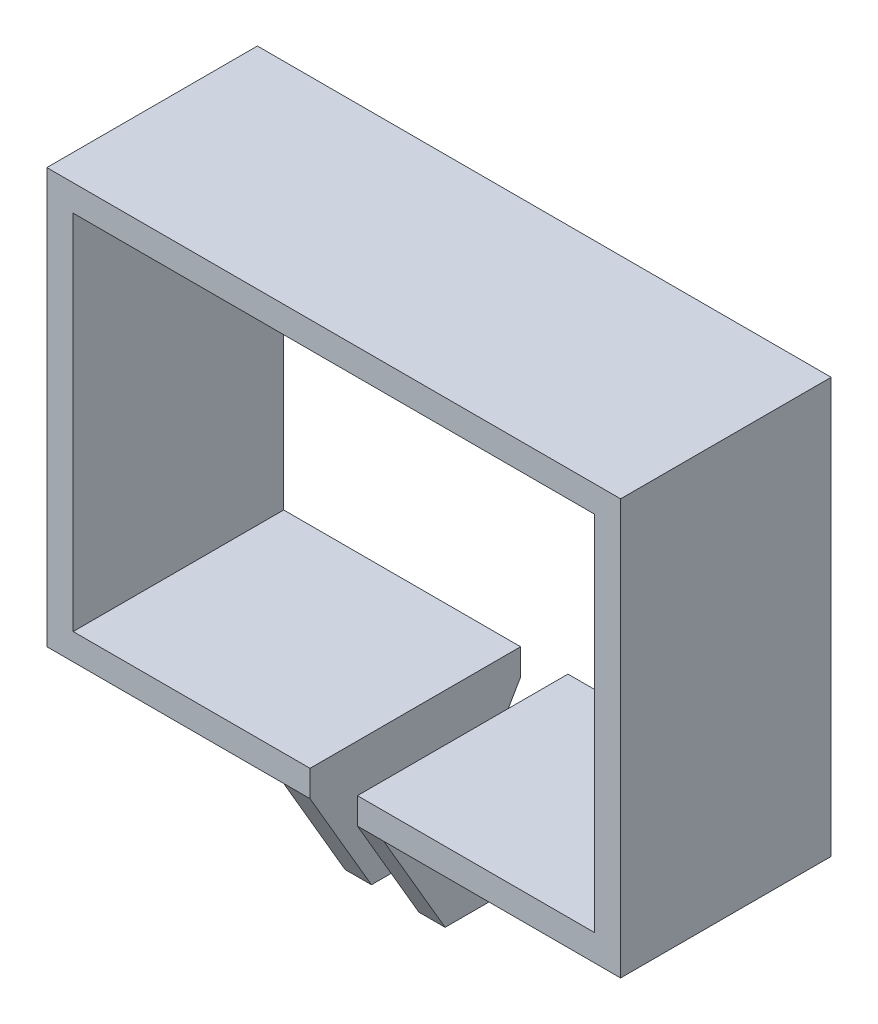
ISO-10303-21;
HEADER;
FILE_DESCRIPTION(('STEP AP214'),'2;1');
FILE_NAME('part.step','',(''),(''),'','','');
FILE_SCHEMA(('AUTOMOTIVE_DESIGN { 1 0 10303 214 1 1 1 1 }'));
ENDSEC;
DATA;
#1=APPLICATION_CONTEXT('core data for automotive mechanical design processes');
#2=APPLICATION_PROTOCOL_DEFINITION('international standard','automotive_design',2000,#1);
#3=PRODUCT_CONTEXT('',#1,'mechanical');
#4=PRODUCT('Part','Part','',(#3));
#5=PRODUCT_RELATED_PRODUCT_CATEGORY('part','',(#4));
#6=PRODUCT_DEFINITION_FORMATION('','',#4);
#7=PRODUCT_DEFINITION_CONTEXT('part definition',#1,'design');
#8=PRODUCT_DEFINITION('design','',#6,#7);
#9=PRODUCT_DEFINITION_SHAPE('','',#8);
#10=(LENGTH_UNIT() NAMED_UNIT(*) SI_UNIT(.MILLI.,.METRE.));
#11=(NAMED_UNIT(*) PLANE_ANGLE_UNIT() SI_UNIT($,.RADIAN.));
#12=(NAMED_UNIT(*) SI_UNIT($,.STERADIAN.) SOLID_ANGLE_UNIT());
#13=UNCERTAINTY_MEASURE_WITH_UNIT(LENGTH_MEASURE(1.E-05),#10,'distance_accuracy_value','');
#14=(GEOMETRIC_REPRESENTATION_CONTEXT(3) GLOBAL_UNCERTAINTY_ASSIGNED_CONTEXT((#13)) GLOBAL_UNIT_ASSIGNED_CONTEXT((#10,
#11,#12)) REPRESENTATION_CONTEXT('',''));
#15=CARTESIAN_POINT('',(0.,0.,0.));
#16=DIRECTION('',(0.,0.,1.));
#17=DIRECTION('',(1.,0.,0.));
#18=AXIS2_PLACEMENT_3D('',#15,#16,#17);
#19=CARTESIAN_POINT('',(-5.70000000000001,-20.65,24.));
#20=DIRECTION('',(1.,0.,0.));
#21=DIRECTION('',(0.,1.,0.));
#22=AXIS2_PLACEMENT_3D('',#19,#20,#21);
#23=PLANE('',#22);
#24=CARTESIAN_POINT('',(-5.70000000000001,-30.65,12.));
#25=DIRECTION('',(-1.,0.,0.));
#26=DIRECTION('',(0.,-1.,0.));
#27=AXIS2_PLACEMENT_3D('',#24,#25,#26);
#28=CIRCLE('',#27,2.25);
#29=CARTESIAN_POINT('',(-5.70000000000001,-32.9,12.));
#30=VERTEX_POINT('',#29);
#31=EDGE_CURVE('E352',#30,#30,#28,.T.);
#32=ORIENTED_EDGE('',*,*,#31,.F.);
#33=EDGE_LOOP('',(#32));
#34=FACE_BOUND('',#33,.T.);
#35=DIRECTION('',(0.,0.,-1.));
#36=VECTOR('',#35,1.);
#37=CARTESIAN_POINT('',(-5.7,-35.65,24.));
#38=LINE('',#37,#36);
#39=CARTESIAN_POINT('',(-5.7,-35.65,17.));
#40=VERTEX_POINT('',#39);
#41=CARTESIAN_POINT('',(-5.7,-35.65,7.));
#42=VERTEX_POINT('',#41);
#43=EDGE_CURVE('E171',#40,#42,#38,.T.);
#44=ORIENTED_EDGE('',*,*,#43,.F.);
#45=DIRECTION('',(0.,-0.863778900898434,-0.503871025524086));
#46=VECTOR('',#45,1.);
#47=CARTESIAN_POINT('',(-5.70000000000001,-23.65,24.));
#48=LINE('',#47,#46);
#49=CARTESIAN_POINT('',(-5.70000000000001,-23.65,24.));
#50=VERTEX_POINT('',#49);
#51=EDGE_CURVE('E157',#50,#40,#48,.T.);
#52=ORIENTED_EDGE('',*,*,#51,.F.);
#53=DIRECTION('',(0.,0.,-1.));
#54=VECTOR('',#53,1.);
#55=CARTESIAN_POINT('',(-5.70000000000001,-23.65,24.));
#56=LINE('',#55,#54);
#57=CARTESIAN_POINT('',(-5.70000000000001,-23.65,0.));
#58=VERTEX_POINT('',#57);
#59=EDGE_CURVE('E239',#50,#58,#56,.T.);
#60=ORIENTED_EDGE('',*,*,#59,.T.);
#61=DIRECTION('',(0.,0.863778900898434,-0.503871025524086));
#62=VECTOR('',#61,1.);
#63=CARTESIAN_POINT('',(-5.70000000000001,-23.65,0.));
#64=LINE('',#63,#62);
#65=EDGE_CURVE('E177',#42,#58,#64,.T.);
#66=ORIENTED_EDGE('',*,*,#65,.F.);
#67=EDGE_LOOP('',(#44,#52,#60,#66));
#68=FACE_BOUND('',#67,.T.);
#69=ADVANCED_FACE('F34',(#34,#68),#23,.F.);
#70=CARTESIAN_POINT('',(-2.7,-35.65,24.));
#71=DIRECTION('',(0.,-1.,0.));
#72=DIRECTION('',(0.,0.,-1.));
#73=AXIS2_PLACEMENT_3D('',#70,#71,#72);
#74=PLANE('',#73);
#75=DIRECTION('',(-1.,0.,0.));
#76=VECTOR('',#75,1.);
#77=CARTESIAN_POINT('',(14.3,-35.65,17.));
#78=LINE('',#77,#76);
#79=CARTESIAN_POINT('',(-2.7,-35.65,17.));
#80=VERTEX_POINT('',#79);
#81=EDGE_CURVE('E160',#80,#40,#78,.T.);
#82=ORIENTED_EDGE('',*,*,#81,.T.);
#83=ORIENTED_EDGE('',*,*,#43,.T.);
#84=DIRECTION('',(-1.,0.,0.));
#85=VECTOR('',#84,1.);
#86=CARTESIAN_POINT('',(14.3,-35.65,7.));
#87=LINE('',#86,#85);
#88=CARTESIAN_POINT('',(-2.7,-35.65,7.));
#89=VERTEX_POINT('',#88);
#90=EDGE_CURVE('E339',#89,#42,#87,.T.);
#91=ORIENTED_EDGE('',*,*,#90,.F.);
#92=DIRECTION('',(0.,0.,-1.));
#93=VECTOR('',#92,1.);
#94=CARTESIAN_POINT('',(-2.7,-35.65,24.));
#95=LINE('',#94,#93);
#96=EDGE_CURVE('E173',#80,#89,#95,.T.);
#97=ORIENTED_EDGE('',*,*,#96,.F.);
#98=EDGE_LOOP('',(#82,#83,#91,#97));
#99=FACE_BOUND('',#98,.T.);
#100=ADVANCED_FACE('F169',(#99),#74,.T.);
#101=CARTESIAN_POINT('',(-2.70000000000001,-20.65,24.));
#102=DIRECTION('',(1.,0.,0.));
#103=DIRECTION('',(0.,1.,0.));
#104=AXIS2_PLACEMENT_3D('',#101,#102,#103);
#105=PLANE('',#104);
#106=CARTESIAN_POINT('',(-2.7,-30.65,12.));
#107=DIRECTION('',(1.,0.,0.));
#108=DIRECTION('',(0.,1.,0.));
#109=AXIS2_PLACEMENT_3D('',#106,#107,#108);
#110=CIRCLE('',#109,2.25);
#111=CARTESIAN_POINT('',(-2.70000000000001,-28.4,12.));
#112=VERTEX_POINT('',#111);
#113=EDGE_CURVE('E165',#112,#112,#110,.T.);
#114=ORIENTED_EDGE('',*,*,#113,.F.);
#115=EDGE_LOOP('',(#114));
#116=FACE_BOUND('',#115,.T.);
#117=DIRECTION('',(0.,0.863778900898434,0.503871025524086));
#118=VECTOR('',#117,1.);
#119=CARTESIAN_POINT('',(-2.70000000000001,-21.4116580310881,25.3056994818653));
#120=LINE('',#119,#118);
#121=CARTESIAN_POINT('',(-2.70000000000001,-23.65,24.));
#122=VERTEX_POINT('',#121);
#123=EDGE_CURVE('E49',#80,#122,#120,.T.);
#124=ORIENTED_EDGE('',*,*,#123,.F.);
#125=ORIENTED_EDGE('',*,*,#96,.T.);
#126=DIRECTION('',(0.,-0.863778900898434,0.503871025524086));
#127=VECTOR('',#126,1.);
#128=CARTESIAN_POINT('',(-2.70000000000001,-31.8572538860104,4.78756476683938));
#129=LINE('',#128,#127);
#130=CARTESIAN_POINT('',(-2.70000000000001,-23.65,0.));
#131=VERTEX_POINT('',#130);
#132=EDGE_CURVE('E194',#131,#89,#129,.T.);
#133=ORIENTED_EDGE('',*,*,#132,.F.);
#134=DIRECTION('',(0.,-1.,0.));
#135=VECTOR('',#134,1.);
#136=CARTESIAN_POINT('',(-2.70000000000001,-20.65,0.));
#137=LINE('',#136,#135);
#138=CARTESIAN_POINT('',(-2.70000000000001,-20.65,0.));
#139=VERTEX_POINT('',#138);
#140=EDGE_CURVE('E202',#139,#131,#137,.T.);
#141=ORIENTED_EDGE('',*,*,#140,.F.);
#142=DIRECTION('',(0.,0.,-1.));
#143=VECTOR('',#142,1.);
#144=CARTESIAN_POINT('',(-2.70000000000001,-20.65,24.));
#145=LINE('',#144,#143);
#146=CARTESIAN_POINT('',(-2.70000000000001,-20.65,24.));
#147=VERTEX_POINT('',#146);
#148=EDGE_CURVE('E182',#147,#139,#145,.T.);
#149=ORIENTED_EDGE('',*,*,#148,.F.);
#150=DIRECTION('',(0.,-1.,0.));
#151=VECTOR('',#150,1.);
#152=CARTESIAN_POINT('',(-2.70000000000001,-20.65,24.));
#153=LINE('',#152,#151);
#154=EDGE_CURVE('E238',#147,#122,#153,.T.);
#155=ORIENTED_EDGE('',*,*,#154,.T.);
#156=EDGE_LOOP('',(#124,#125,#133,#141,#149,#155));
#157=FACE_BOUND('',#156,.T.);
#158=ADVANCED_FACE('F201',(#116,#157),#105,.T.);
#159=CARTESIAN_POINT('',(-29.7,-20.65,24.));
#160=DIRECTION('',(0.,1.,0.));
#161=DIRECTION('',(0.,0.,1.));
#162=AXIS2_PLACEMENT_3D('',#159,#160,#161);
#163=PLANE('',#162);
#164=DIRECTION('',(1.,0.,0.));
#165=VECTOR('',#164,1.);
#166=CARTESIAN_POINT('',(-29.7,-20.65,0.));
#167=LINE('',#166,#165);
#168=CARTESIAN_POINT('',(-29.7,-20.65,0.));
#169=VERTEX_POINT('',#168);
#170=EDGE_CURVE('E208',#169,#139,#167,.T.);
#171=ORIENTED_EDGE('',*,*,#170,.F.);
#172=DIRECTION('',(0.,0.,-1.));
#173=VECTOR('',#172,1.);
#174=CARTESIAN_POINT('',(-29.7,-20.65,24.));
#175=LINE('',#174,#173);
#176=CARTESIAN_POINT('',(-29.7,-20.65,24.));
#177=VERTEX_POINT('',#176);
#178=EDGE_CURVE('E269',#177,#169,#175,.T.);
#179=ORIENTED_EDGE('',*,*,#178,.F.);
#180=DIRECTION('',(1.,0.,0.));
#181=VECTOR('',#180,1.);
#182=CARTESIAN_POINT('',(-29.7,-20.65,24.));
#183=LINE('',#182,#181);
#184=EDGE_CURVE('E274',#177,#147,#183,.T.);
#185=ORIENTED_EDGE('',*,*,#184,.T.);
#186=ORIENTED_EDGE('',*,*,#148,.T.);
#187=EDGE_LOOP('',(#171,#179,#185,#186));
#188=FACE_BOUND('',#187,.T.);
#189=ADVANCED_FACE('F272',(#188),#163,.T.);
#190=CARTESIAN_POINT('',(-29.7,-20.65,24.));
#191=DIRECTION('',(1.,0.,0.));
#192=DIRECTION('',(0.,0.,-1.));
#193=AXIS2_PLACEMENT_3D('',#190,#191,#192);
#194=PLANE('',#193);
#195=DIRECTION('',(0.,-1.,0.));
#196=VECTOR('',#195,1.);
#197=CARTESIAN_POINT('',(-29.7,-20.65,0.));
#198=LINE('',#197,#196);
#199=CARTESIAN_POINT('',(-29.7,20.65,0.));
#200=VERTEX_POINT('',#199);
#201=EDGE_CURVE('E210',#200,#169,#198,.T.);
#202=ORIENTED_EDGE('',*,*,#201,.F.);
#203=DIRECTION('',(0.,0.,-1.));
#204=VECTOR('',#203,1.);
#205=CARTESIAN_POINT('',(-29.7,20.65,24.));
#206=LINE('',#205,#204);
#207=CARTESIAN_POINT('',(-29.7,20.65,24.));
#208=VERTEX_POINT('',#207);
#209=EDGE_CURVE('E267',#208,#200,#206,.T.);
#210=ORIENTED_EDGE('',*,*,#209,.F.);
#211=DIRECTION('',(0.,-1.,0.));
#212=VECTOR('',#211,1.);
#213=CARTESIAN_POINT('',(-29.7,-20.65,24.));
#214=LINE('',#213,#212);
#215=EDGE_CURVE('E281',#208,#177,#214,.T.);
#216=ORIENTED_EDGE('',*,*,#215,.T.);
#217=ORIENTED_EDGE('',*,*,#178,.T.);
#218=EDGE_LOOP('',(#202,#210,#216,#217));
#219=FACE_BOUND('',#218,.T.);
#220=ADVANCED_FACE('F385',(#219),#194,.T.);
#221=CARTESIAN_POINT('',(-29.7,20.65,24.));
#222=DIRECTION('',(0.,-1.,0.));
#223=DIRECTION('',(0.,0.,-1.));
#224=AXIS2_PLACEMENT_3D('',#221,#222,#223);
#225=PLANE('',#224);
#226=DIRECTION('',(-1.,0.,0.));
#227=VECTOR('',#226,1.);
#228=CARTESIAN_POINT('',(-29.7,20.65,0.));
#229=LINE('',#228,#227);
#230=CARTESIAN_POINT('',(29.7,20.65,0.));
#231=VERTEX_POINT('',#230);
#232=EDGE_CURVE('E217',#231,#200,#229,.T.);
#233=ORIENTED_EDGE('',*,*,#232,.F.);
#234=DIRECTION('',(0.,0.,-1.));
#235=VECTOR('',#234,1.);
#236=CARTESIAN_POINT('',(29.7,20.65,24.));
#237=LINE('',#236,#235);
#238=CARTESIAN_POINT('',(29.7,20.65,24.));
#239=VERTEX_POINT('',#238);
#240=EDGE_CURVE('E265',#239,#231,#237,.T.);
#241=ORIENTED_EDGE('',*,*,#240,.F.);
#242=DIRECTION('',(-1.,0.,0.));
#243=VECTOR('',#242,1.);
#244=CARTESIAN_POINT('',(-29.7,20.65,24.));
#245=LINE('',#244,#243);
#246=EDGE_CURVE('E286',#239,#208,#245,.T.);
#247=ORIENTED_EDGE('',*,*,#246,.T.);
#248=ORIENTED_EDGE('',*,*,#209,.T.);
#249=EDGE_LOOP('',(#233,#241,#247,#248));
#250=FACE_BOUND('',#249,.T.);
#251=ADVANCED_FACE('F388',(#250),#225,.T.);
#252=CARTESIAN_POINT('',(29.7,20.65,24.));
#253=DIRECTION('',(-1.,0.,0.));
#254=DIRECTION('',(0.,-1.,0.));
#255=AXIS2_PLACEMENT_3D('',#252,#253,#254);
#256=PLANE('',#255);
#257=DIRECTION('',(0.,1.,0.));
#258=VECTOR('',#257,1.);
#259=CARTESIAN_POINT('',(29.7,20.65,0.));
#260=LINE('',#259,#258);
#261=CARTESIAN_POINT('',(29.7,-20.65,0.));
#262=VERTEX_POINT('',#261);
#263=EDGE_CURVE('E220',#262,#231,#260,.T.);
#264=ORIENTED_EDGE('',*,*,#263,.F.);
#265=DIRECTION('',(0.,0.,-1.));
#266=VECTOR('',#265,1.);
#267=CARTESIAN_POINT('',(29.7,-20.65,24.));
#268=LINE('',#267,#266);
#269=CARTESIAN_POINT('',(29.7,-20.65,24.));
#270=VERTEX_POINT('',#269);
#271=EDGE_CURVE('E263',#270,#262,#268,.T.);
#272=ORIENTED_EDGE('',*,*,#271,.F.);
#273=DIRECTION('',(0.,1.,0.));
#274=VECTOR('',#273,1.);
#275=CARTESIAN_POINT('',(29.7,20.65,24.));
#276=LINE('',#275,#274);
#277=EDGE_CURVE('E289',#270,#239,#276,.T.);
#278=ORIENTED_EDGE('',*,*,#277,.T.);
#279=ORIENTED_EDGE('',*,*,#240,.T.);
#280=EDGE_LOOP('',(#264,#272,#278,#279));
#281=FACE_BOUND('',#280,.T.);
#282=ADVANCED_FACE('F392',(#281),#256,.T.);
#283=CARTESIAN_POINT('',(29.7,-20.65,24.));
#284=DIRECTION('',(0.,1.,0.));
#285=DIRECTION('',(-1.,0.,0.));
#286=AXIS2_PLACEMENT_3D('',#283,#284,#285);
#287=PLANE('',#286);
#288=DIRECTION('',(1.,0.,0.));
#289=VECTOR('',#288,1.);
#290=CARTESIAN_POINT('',(29.7,-20.65,0.));
#291=LINE('',#290,#289);
#292=CARTESIAN_POINT('',(2.7,-20.65,0.));
#293=VERTEX_POINT('',#292);
#294=EDGE_CURVE('E223',#293,#262,#291,.T.);
#295=ORIENTED_EDGE('',*,*,#294,.F.);
#296=DIRECTION('',(0.,0.,-1.));
#297=VECTOR('',#296,1.);
#298=CARTESIAN_POINT('',(2.7,-20.65,24.));
#299=LINE('',#298,#297);
#300=CARTESIAN_POINT('',(2.7,-20.65,24.));
#301=VERTEX_POINT('',#300);
#302=EDGE_CURVE('E260',#301,#293,#299,.T.);
#303=ORIENTED_EDGE('',*,*,#302,.F.);
#304=DIRECTION('',(1.,0.,0.));
#305=VECTOR('',#304,1.);
#306=CARTESIAN_POINT('',(29.7,-20.65,24.));
#307=LINE('',#306,#305);
#308=EDGE_CURVE('E292',#301,#270,#307,.T.);
#309=ORIENTED_EDGE('',*,*,#308,.T.);
#310=ORIENTED_EDGE('',*,*,#271,.T.);
#311=EDGE_LOOP('',(#295,#303,#309,#310));
#312=FACE_BOUND('',#311,.T.);
#313=ADVANCED_FACE('F396',(#312),#287,.T.);
#314=CARTESIAN_POINT('',(2.7,-20.65,24.));
#315=DIRECTION('',(-1.,0.,0.));
#316=DIRECTION('',(0.,-1.,0.));
#317=AXIS2_PLACEMENT_3D('',#314,#315,#316);
#318=PLANE('',#317);
#319=CARTESIAN_POINT('',(2.7,-30.65,12.));
#320=DIRECTION('',(-1.,0.,0.));
#321=DIRECTION('',(0.,-1.,0.));
#322=AXIS2_PLACEMENT_3D('',#319,#320,#321);
#323=CIRCLE('',#322,2.25);
#324=CARTESIAN_POINT('',(2.7,-32.9,12.));
#325=VERTEX_POINT('',#324);
#326=EDGE_CURVE('E349',#325,#325,#323,.T.);
#327=ORIENTED_EDGE('',*,*,#326,.F.);
#328=EDGE_LOOP('',(#327));
#329=FACE_BOUND('',#328,.T.);
#330=DIRECTION('',(0.,-0.863778900898434,-0.503871025524086));
#331=VECTOR('',#330,1.);
#332=CARTESIAN_POINT('',(2.7,-21.4116580310881,25.3056994818653));
#333=LINE('',#332,#331);
#334=CARTESIAN_POINT('',(2.7,-23.65,24.));
#335=VERTEX_POINT('',#334);
#336=CARTESIAN_POINT('',(2.7,-35.65,17.));
#337=VERTEX_POINT('',#336);
#338=EDGE_CURVE('E344',#335,#337,#333,.T.);
#339=ORIENTED_EDGE('',*,*,#338,.F.);
#340=DIRECTION('',(0.,1.,0.));
#341=VECTOR('',#340,1.);
#342=CARTESIAN_POINT('',(2.7,-20.65,24.));
#343=LINE('',#342,#341);
#344=EDGE_CURVE('E295',#335,#301,#343,.T.);
#345=ORIENTED_EDGE('',*,*,#344,.T.);
#346=ORIENTED_EDGE('',*,*,#302,.T.);
#347=DIRECTION('',(0.,1.,0.));
#348=VECTOR('',#347,1.);
#349=CARTESIAN_POINT('',(2.7,-20.65,0.));
#350=LINE('',#349,#348);
#351=CARTESIAN_POINT('',(2.7,-23.65,0.));
#352=VERTEX_POINT('',#351);
#353=EDGE_CURVE('E226',#352,#293,#350,.T.);
#354=ORIENTED_EDGE('',*,*,#353,.F.);
#355=DIRECTION('',(0.,0.863778900898434,-0.503871025524086));
#356=VECTOR('',#355,1.);
#357=CARTESIAN_POINT('',(2.7,-31.8572538860104,4.78756476683938));
#358=LINE('',#357,#356);
#359=CARTESIAN_POINT('',(2.7,-35.65,7.));
#360=VERTEX_POINT('',#359);
#361=EDGE_CURVE('E56',#360,#352,#358,.T.);
#362=ORIENTED_EDGE('',*,*,#361,.F.);
#363=DIRECTION('',(0.,0.,-1.));
#364=VECTOR('',#363,1.);
#365=CARTESIAN_POINT('',(2.7,-35.65,24.));
#366=LINE('',#365,#364);
#367=EDGE_CURVE('E258',#337,#360,#366,.T.);
#368=ORIENTED_EDGE('',*,*,#367,.F.);
#369=EDGE_LOOP('',(#339,#345,#346,#354,#362,#368));
#370=FACE_BOUND('',#369,.T.);
#371=ADVANCED_FACE('F400',(#329,#370),#318,.T.);
#372=CARTESIAN_POINT('',(5.7,-35.65,24.));
#373=DIRECTION('',(0.,-1.,0.));
#374=DIRECTION('',(0.,0.,-1.));
#375=AXIS2_PLACEMENT_3D('',#372,#373,#374);
#376=PLANE('',#375);
#377=CARTESIAN_POINT('',(5.7,-35.65,17.));
#378=VERTEX_POINT('',#377);
#379=EDGE_CURVE('E174',#378,#337,#78,.T.);
#380=ORIENTED_EDGE('',*,*,#379,.T.);
#381=ORIENTED_EDGE('',*,*,#367,.T.);
#382=CARTESIAN_POINT('',(5.7,-35.65,7.));
#383=VERTEX_POINT('',#382);
#384=EDGE_CURVE('E337',#383,#360,#87,.T.);
#385=ORIENTED_EDGE('',*,*,#384,.F.);
#386=DIRECTION('',(0.,0.,-1.));
#387=VECTOR('',#386,1.);
#388=CARTESIAN_POINT('',(5.7,-35.65,24.));
#389=LINE('',#388,#387);
#390=EDGE_CURVE('E256',#378,#383,#389,.T.);
#391=ORIENTED_EDGE('',*,*,#390,.F.);
#392=EDGE_LOOP('',(#380,#381,#385,#391));
#393=FACE_BOUND('',#392,.T.);
#394=ADVANCED_FACE('F404',(#393),#376,.T.);
#395=CARTESIAN_POINT('',(5.7,-20.65,24.));
#396=DIRECTION('',(-1.,0.,0.));
#397=DIRECTION('',(0.,-1.,0.));
#398=AXIS2_PLACEMENT_3D('',#395,#396,#397);
#399=PLANE('',#398);
#400=CARTESIAN_POINT('',(5.7,-30.65,12.));
#401=DIRECTION('',(-1.,0.,0.));
#402=DIRECTION('',(0.,-1.,0.));
#403=AXIS2_PLACEMENT_3D('',#400,#401,#402);
#404=CIRCLE('',#403,2.25);
#405=CARTESIAN_POINT('',(5.7,-32.9,12.));
#406=VERTEX_POINT('',#405);
#407=EDGE_CURVE('E37',#406,#406,#404,.T.);
#408=ORIENTED_EDGE('',*,*,#407,.T.);
#409=EDGE_LOOP('',(#408));
#410=FACE_BOUND('',#409,.T.);
#411=DIRECTION('',(0.,0.,-1.));
#412=VECTOR('',#411,1.);
#413=CARTESIAN_POINT('',(5.7,-23.65,24.));
#414=LINE('',#413,#412);
#415=CARTESIAN_POINT('',(5.7,-23.65,24.));
#416=VERTEX_POINT('',#415);
#417=CARTESIAN_POINT('',(5.7,-23.65,0.));
#418=VERTEX_POINT('',#417);
#419=EDGE_CURVE('E253',#416,#418,#414,.T.);
#420=ORIENTED_EDGE('',*,*,#419,.F.);
#421=DIRECTION('',(0.,-0.863778900898434,-0.503871025524086));
#422=VECTOR('',#421,1.);
#423=CARTESIAN_POINT('',(5.7,-21.4116580310881,25.3056994818653));
#424=LINE('',#423,#422);
#425=EDGE_CURVE('E332',#416,#378,#424,.T.);
#426=ORIENTED_EDGE('',*,*,#425,.T.);
#427=ORIENTED_EDGE('',*,*,#390,.T.);
#428=DIRECTION('',(0.,0.863778900898434,-0.503871025524086));
#429=VECTOR('',#428,1.);
#430=CARTESIAN_POINT('',(5.7,-31.8572538860104,4.78756476683938));
#431=LINE('',#430,#429);
#432=EDGE_CURVE('E335',#383,#418,#431,.T.);
#433=ORIENTED_EDGE('',*,*,#432,.T.);
#434=EDGE_LOOP('',(#420,#426,#427,#433));
#435=FACE_BOUND('',#434,.T.);
#436=ADVANCED_FACE('F331',(#410,#435),#399,.F.);
#437=CARTESIAN_POINT('',(29.7,-23.65,24.));
#438=DIRECTION('',(0.,1.,0.));
#439=DIRECTION('',(-1.,0.,0.));
#440=AXIS2_PLACEMENT_3D('',#437,#438,#439);
#441=PLANE('',#440);
#442=DIRECTION('',(1.,0.,0.));
#443=VECTOR('',#442,1.);
#444=CARTESIAN_POINT('',(29.7,-23.65,0.));
#445=LINE('',#444,#443);
#446=CARTESIAN_POINT('',(32.7,-23.65,0.));
#447=VERTEX_POINT('',#446);
#448=EDGE_CURVE('E228',#418,#447,#445,.T.);
#449=ORIENTED_EDGE('',*,*,#448,.T.);
#450=DIRECTION('',(0.,0.,-1.));
#451=VECTOR('',#450,1.);
#452=CARTESIAN_POINT('',(32.7,-23.65,24.));
#453=LINE('',#452,#451);
#454=CARTESIAN_POINT('',(32.7,-23.65,24.));
#455=VERTEX_POINT('',#454);
#456=EDGE_CURVE('E250',#455,#447,#453,.T.);
#457=ORIENTED_EDGE('',*,*,#456,.F.);
#458=DIRECTION('',(1.,0.,0.));
#459=VECTOR('',#458,1.);
#460=CARTESIAN_POINT('',(29.7,-23.65,24.));
#461=LINE('',#460,#459);
#462=EDGE_CURVE('E297',#416,#455,#461,.T.);
#463=ORIENTED_EDGE('',*,*,#462,.F.);
#464=ORIENTED_EDGE('',*,*,#419,.T.);
#465=EDGE_LOOP('',(#449,#457,#463,#464));
#466=FACE_BOUND('',#465,.T.);
#467=ADVANCED_FACE('F326',(#466),#441,.F.);
#468=CARTESIAN_POINT('',(32.7,20.65,24.));
#469=DIRECTION('',(-1.,0.,0.));
#470=DIRECTION('',(0.,-1.,0.));
#471=AXIS2_PLACEMENT_3D('',#468,#469,#470);
#472=PLANE('',#471);
#473=DIRECTION('',(0.,1.,0.));
#474=VECTOR('',#473,1.);
#475=CARTESIAN_POINT('',(32.7,20.65,0.));
#476=LINE('',#475,#474);
#477=CARTESIAN_POINT('',(32.7,23.65,0.));
#478=VERTEX_POINT('',#477);
#479=EDGE_CURVE('E230',#447,#478,#476,.T.);
#480=ORIENTED_EDGE('',*,*,#479,.T.);
#481=DIRECTION('',(0.,0.,-1.));
#482=VECTOR('',#481,1.);
#483=CARTESIAN_POINT('',(32.7,23.65,24.));
#484=LINE('',#483,#482);
#485=CARTESIAN_POINT('',(32.7,23.65,24.));
#486=VERTEX_POINT('',#485);
#487=EDGE_CURVE('E247',#486,#478,#484,.T.);
#488=ORIENTED_EDGE('',*,*,#487,.F.);
#489=DIRECTION('',(0.,1.,0.));
#490=VECTOR('',#489,1.);
#491=CARTESIAN_POINT('',(32.7,20.65,24.));
#492=LINE('',#491,#490);
#493=EDGE_CURVE('E299',#455,#486,#492,.T.);
#494=ORIENTED_EDGE('',*,*,#493,.F.);
#495=ORIENTED_EDGE('',*,*,#456,.T.);
#496=EDGE_LOOP('',(#480,#488,#494,#495));
#497=FACE_BOUND('',#496,.T.);
#498=ADVANCED_FACE('F321',(#497),#472,.F.);
#499=CARTESIAN_POINT('',(-29.7,23.65,24.));
#500=DIRECTION('',(0.,-1.,0.));
#501=DIRECTION('',(0.,0.,-1.));
#502=AXIS2_PLACEMENT_3D('',#499,#500,#501);
#503=PLANE('',#502);
#504=DIRECTION('',(1.,0.,0.));
#505=VECTOR('',#504,1.);
#506=CARTESIAN_POINT('',(-29.7,23.65,0.));
#507=LINE('',#506,#505);
#508=CARTESIAN_POINT('',(-32.7,23.65,0.));
#509=VERTEX_POINT('',#508);
#510=EDGE_CURVE('E232',#478,#509,#507,.F.);
#511=ORIENTED_EDGE('',*,*,#510,.T.);
#512=DIRECTION('',(0.,0.,-1.));
#513=VECTOR('',#512,1.);
#514=CARTESIAN_POINT('',(-32.7,23.65,24.));
#515=LINE('',#514,#513);
#516=CARTESIAN_POINT('',(-32.7,23.65,24.));
#517=VERTEX_POINT('',#516);
#518=EDGE_CURVE('E244',#517,#509,#515,.T.);
#519=ORIENTED_EDGE('',*,*,#518,.F.);
#520=DIRECTION('',(1.,0.,0.));
#521=VECTOR('',#520,1.);
#522=CARTESIAN_POINT('',(-29.7,23.65,24.));
#523=LINE('',#522,#521);
#524=EDGE_CURVE('E301',#486,#517,#523,.F.);
#525=ORIENTED_EDGE('',*,*,#524,.F.);
#526=ORIENTED_EDGE('',*,*,#487,.T.);
#527=EDGE_LOOP('',(#511,#519,#525,#526));
#528=FACE_BOUND('',#527,.T.);
#529=ADVANCED_FACE('F317',(#528),#503,.F.);
#530=CARTESIAN_POINT('',(-32.7,-20.65,24.));
#531=DIRECTION('',(1.,0.,0.));
#532=DIRECTION('',(0.,0.,-1.));
#533=AXIS2_PLACEMENT_3D('',#530,#531,#532);
#534=PLANE('',#533);
#535=DIRECTION('',(0.,1.,0.));
#536=VECTOR('',#535,1.);
#537=CARTESIAN_POINT('',(-32.7,-20.65,0.));
#538=LINE('',#537,#536);
#539=CARTESIAN_POINT('',(-32.7,-23.65,0.));
#540=VERTEX_POINT('',#539);
#541=EDGE_CURVE('E234',#509,#540,#538,.F.);
#542=ORIENTED_EDGE('',*,*,#541,.T.);
#543=DIRECTION('',(0.,0.,-1.));
#544=VECTOR('',#543,1.);
#545=CARTESIAN_POINT('',(-32.7,-23.65,24.));
#546=LINE('',#545,#544);
#547=CARTESIAN_POINT('',(-32.7,-23.65,24.));
#548=VERTEX_POINT('',#547);
#549=EDGE_CURVE('E241',#548,#540,#546,.T.);
#550=ORIENTED_EDGE('',*,*,#549,.F.);
#551=DIRECTION('',(0.,1.,0.));
#552=VECTOR('',#551,1.);
#553=CARTESIAN_POINT('',(-32.7,-20.65,24.));
#554=LINE('',#553,#552);
#555=EDGE_CURVE('E302',#517,#548,#554,.F.);
#556=ORIENTED_EDGE('',*,*,#555,.F.);
#557=ORIENTED_EDGE('',*,*,#518,.T.);
#558=EDGE_LOOP('',(#542,#550,#556,#557));
#559=FACE_BOUND('',#558,.T.);
#560=ADVANCED_FACE('F313',(#559),#534,.F.);
#561=CARTESIAN_POINT('',(-29.7,-23.65,24.));
#562=DIRECTION('',(0.,1.,0.));
#563=DIRECTION('',(0.,0.,1.));
#564=AXIS2_PLACEMENT_3D('',#561,#562,#563);
#565=PLANE('',#564);
#566=DIRECTION('',(1.,0.,0.));
#567=VECTOR('',#566,1.);
#568=CARTESIAN_POINT('',(-29.7,-23.65,0.));
#569=LINE('',#568,#567);
#570=EDGE_CURVE('E236',#540,#58,#569,.T.);
#571=ORIENTED_EDGE('',*,*,#570,.T.);
#572=ORIENTED_EDGE('',*,*,#59,.F.);
#573=DIRECTION('',(1.,0.,0.));
#574=VECTOR('',#573,1.);
#575=CARTESIAN_POINT('',(-29.7,-23.65,24.));
#576=LINE('',#575,#574);
#577=EDGE_CURVE('E213',#548,#50,#576,.T.);
#578=ORIENTED_EDGE('',*,*,#577,.F.);
#579=ORIENTED_EDGE('',*,*,#549,.T.);
#580=EDGE_LOOP('',(#571,#572,#578,#579));
#581=FACE_BOUND('',#580,.T.);
#582=ADVANCED_FACE('F308',(#581),#565,.F.);
#583=CARTESIAN_POINT('',(0.,0.,24.));
#584=DIRECTION('',(0.,0.,-1.));
#585=DIRECTION('',(-1.,0.,0.));
#586=AXIS2_PLACEMENT_3D('',#583,#584,#585);
#587=PLANE('',#586);
#588=ORIENTED_EDGE('',*,*,#577,.T.);
#589=DIRECTION('',(1.,0.,0.));
#590=VECTOR('',#589,1.);
#591=CARTESIAN_POINT('',(0.,-23.65,24.));
#592=LINE('',#591,#590);
#593=EDGE_CURVE('E11',#50,#122,#592,.T.);
#594=ORIENTED_EDGE('',*,*,#593,.T.);
#595=ORIENTED_EDGE('',*,*,#154,.F.);
#596=ORIENTED_EDGE('',*,*,#184,.F.);
#597=ORIENTED_EDGE('',*,*,#215,.F.);
#598=ORIENTED_EDGE('',*,*,#246,.F.);
#599=ORIENTED_EDGE('',*,*,#277,.F.);
#600=ORIENTED_EDGE('',*,*,#308,.F.);
#601=ORIENTED_EDGE('',*,*,#344,.F.);
#602=EDGE_CURVE('E42',#335,#416,#592,.T.);
#603=ORIENTED_EDGE('',*,*,#602,.T.);
#604=ORIENTED_EDGE('',*,*,#462,.T.);
#605=ORIENTED_EDGE('',*,*,#493,.T.);
#606=ORIENTED_EDGE('',*,*,#524,.T.);
#607=ORIENTED_EDGE('',*,*,#555,.T.);
#608=EDGE_LOOP('',(#588,#594,#595,#596,#597,#598,#599,#600,#601,#603,#604,#605,#606,#607));
#609=FACE_BOUND('',#608,.T.);
#610=ADVANCED_FACE('F277',(#609),#587,.F.);
#611=CARTESIAN_POINT('',(0.,0.,0.));
#612=DIRECTION('',(0.,0.,-1.));
#613=DIRECTION('',(-1.,0.,0.));
#614=AXIS2_PLACEMENT_3D('',#611,#612,#613);
#615=PLANE('',#614);
#616=DIRECTION('',(1.,0.,0.));
#617=VECTOR('',#616,1.);
#618=CARTESIAN_POINT('',(0.,-23.65,0.));
#619=LINE('',#618,#617);
#620=EDGE_CURVE('E180',#58,#131,#619,.T.);
#621=ORIENTED_EDGE('',*,*,#620,.F.);
#622=ORIENTED_EDGE('',*,*,#570,.F.);
#623=ORIENTED_EDGE('',*,*,#541,.F.);
#624=ORIENTED_EDGE('',*,*,#510,.F.);
#625=ORIENTED_EDGE('',*,*,#479,.F.);
#626=ORIENTED_EDGE('',*,*,#448,.F.);
#627=EDGE_CURVE('E178',#352,#418,#619,.T.);
#628=ORIENTED_EDGE('',*,*,#627,.F.);
#629=ORIENTED_EDGE('',*,*,#353,.T.);
#630=ORIENTED_EDGE('',*,*,#294,.T.);
#631=ORIENTED_EDGE('',*,*,#263,.T.);
#632=ORIENTED_EDGE('',*,*,#232,.T.);
#633=ORIENTED_EDGE('',*,*,#201,.T.);
#634=ORIENTED_EDGE('',*,*,#170,.T.);
#635=ORIENTED_EDGE('',*,*,#140,.T.);
#636=EDGE_LOOP('',(#621,#622,#623,#624,#625,#626,#628,#629,#630,#631,#632,#633,#634,#635));
#637=FACE_BOUND('',#636,.T.);
#638=ADVANCED_FACE('F205',(#637),#615,.T.);
#639=CARTESIAN_POINT('',(14.3,-23.65,0.));
#640=DIRECTION('',(0.,0.503871025524086,0.863778900898434));
#641=DIRECTION('',(0.,-0.863778900898434,0.503871025524086));
#642=AXIS2_PLACEMENT_3D('',#639,#640,#641);
#643=PLANE('',#642);
#644=ORIENTED_EDGE('',*,*,#361,.T.);
#645=ORIENTED_EDGE('',*,*,#627,.T.);
#646=ORIENTED_EDGE('',*,*,#432,.F.);
#647=ORIENTED_EDGE('',*,*,#384,.T.);
#648=EDGE_LOOP('',(#644,#645,#646,#647));
#649=FACE_BOUND('',#648,.T.);
#650=ADVANCED_FACE('F423',(#649),#643,.F.);
#651=ORIENTED_EDGE('',*,*,#132,.T.);
#652=ORIENTED_EDGE('',*,*,#90,.T.);
#653=ORIENTED_EDGE('',*,*,#65,.T.);
#654=ORIENTED_EDGE('',*,*,#620,.T.);
#655=EDGE_LOOP('',(#651,#652,#653,#654));
#656=FACE_BOUND('',#655,.T.);
#657=ADVANCED_FACE('F193',(#656),#643,.F.);
#658=CARTESIAN_POINT('',(14.3,-23.65,24.));
#659=DIRECTION('',(0.,0.503871025524086,-0.863778900898434));
#660=DIRECTION('',(0.,0.863778900898434,0.503871025524086));
#661=AXIS2_PLACEMENT_3D('',#658,#659,#660);
#662=PLANE('',#661);
#663=ORIENTED_EDGE('',*,*,#338,.T.);
#664=ORIENTED_EDGE('',*,*,#379,.F.);
#665=ORIENTED_EDGE('',*,*,#425,.F.);
#666=ORIENTED_EDGE('',*,*,#602,.F.);
#667=EDGE_LOOP('',(#663,#664,#665,#666));
#668=FACE_BOUND('',#667,.T.);
#669=ADVANCED_FACE('F370',(#668),#662,.F.);
#670=ORIENTED_EDGE('',*,*,#123,.T.);
#671=ORIENTED_EDGE('',*,*,#593,.F.);
#672=ORIENTED_EDGE('',*,*,#51,.T.);
#673=ORIENTED_EDGE('',*,*,#81,.F.);
#674=EDGE_LOOP('',(#670,#671,#672,#673));
#675=FACE_BOUND('',#674,.T.);
#676=ADVANCED_FACE('F159',(#675),#662,.F.);
#677=CARTESIAN_POINT('',(14.3,-30.65,12.));
#678=DIRECTION('',(-1.,0.,0.));
#679=DIRECTION('',(0.,-1.,0.));
#680=AXIS2_PLACEMENT_3D('',#677,#678,#679);
#681=CYLINDRICAL_SURFACE('',#680,2.25);
#682=ORIENTED_EDGE('',*,*,#326,.T.);
#683=EDGE_LOOP('',(#682));
#684=FACE_BOUND('',#683,.T.);
#685=ORIENTED_EDGE('',*,*,#407,.F.);
#686=EDGE_LOOP('',(#685));
#687=FACE_BOUND('',#686,.T.);
#688=ADVANCED_FACE('F360',(#684,#687),#681,.F.);
#689=ORIENTED_EDGE('',*,*,#113,.T.);
#690=EDGE_LOOP('',(#689));
#691=FACE_BOUND('',#690,.T.);
#692=ORIENTED_EDGE('',*,*,#31,.T.);
#693=EDGE_LOOP('',(#692));
#694=FACE_BOUND('',#693,.T.);
#695=ADVANCED_FACE('F362',(#691,#694),#681,.F.);
#696=CLOSED_SHELL('',(#69,#100,#158,#189,#220,#251,#282,#313,#371,#394,#436,#467,#498,#529,#560,
#582,#610,#638,#650,#657,#669,#676,#688,#695));
#697=MANIFOLD_SOLID_BREP('B2',#696);
#698=ADVANCED_BREP_SHAPE_REPRESENTATION('',(#18,#697),#14);
#699=SHAPE_DEFINITION_REPRESENTATION(#9,#698);
ENDSEC;
END-ISO-10303-21;
